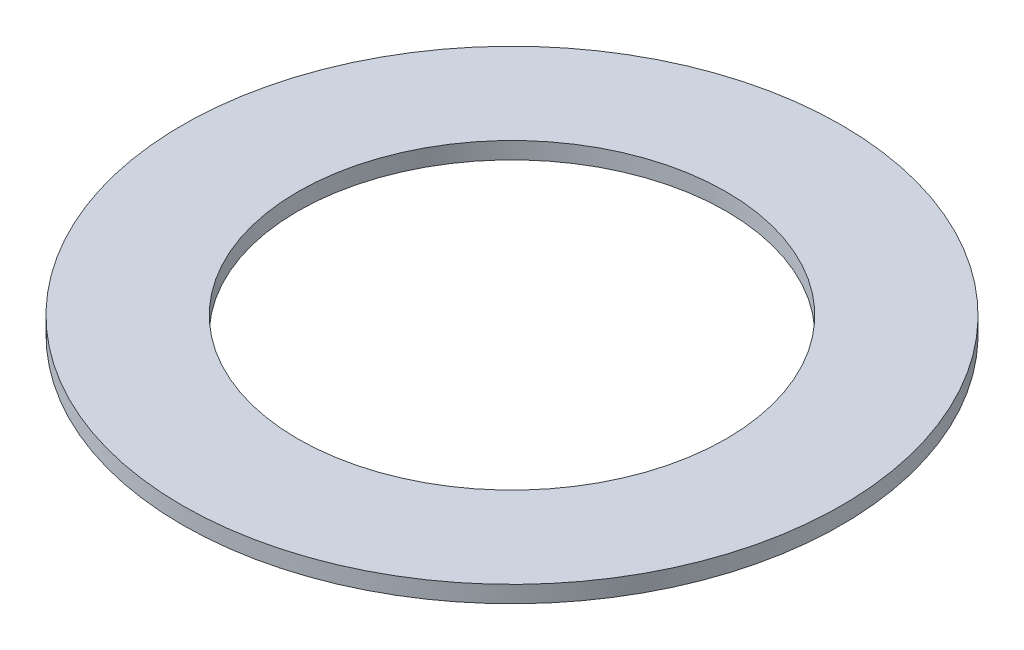
ISO-10303-21;
HEADER;
FILE_DESCRIPTION(('STEP AP214'),'2;1');
FILE_NAME('part.step','',(''),(''),'','','');
FILE_SCHEMA(('AUTOMOTIVE_DESIGN { 1 0 10303 214 1 1 1 1 }'));
ENDSEC;
DATA;
#1=APPLICATION_CONTEXT('core data for automotive mechanical design processes');
#2=APPLICATION_PROTOCOL_DEFINITION('international standard','automotive_design',2000,#1);
#3=PRODUCT_CONTEXT('',#1,'mechanical');
#4=PRODUCT('Part','Part','',(#3));
#5=PRODUCT_RELATED_PRODUCT_CATEGORY('part','',(#4));
#6=PRODUCT_DEFINITION_FORMATION('','',#4);
#7=PRODUCT_DEFINITION_CONTEXT('part definition',#1,'design');
#8=PRODUCT_DEFINITION('design','',#6,#7);
#9=PRODUCT_DEFINITION_SHAPE('','',#8);
#10=(LENGTH_UNIT() NAMED_UNIT(*) SI_UNIT(.MILLI.,.METRE.));
#11=(NAMED_UNIT(*) PLANE_ANGLE_UNIT() SI_UNIT($,.RADIAN.));
#12=(NAMED_UNIT(*) SI_UNIT($,.STERADIAN.) SOLID_ANGLE_UNIT());
#13=UNCERTAINTY_MEASURE_WITH_UNIT(LENGTH_MEASURE(1.E-05),#10,'distance_accuracy_value','');
#14=(GEOMETRIC_REPRESENTATION_CONTEXT(3) GLOBAL_UNCERTAINTY_ASSIGNED_CONTEXT((#13)) GLOBAL_UNIT_ASSIGNED_CONTEXT((#10,
#11,#12)) REPRESENTATION_CONTEXT('',''));
#15=CARTESIAN_POINT('',(0.,0.,0.));
#16=DIRECTION('',(0.,0.,1.));
#17=DIRECTION('',(1.,0.,0.));
#18=AXIS2_PLACEMENT_3D('',#15,#16,#17);
#19=CARTESIAN_POINT('',(0.,4.,0.));
#20=DIRECTION('',(0.,1.,0.));
#21=DIRECTION('',(0.,0.,1.));
#22=AXIS2_PLACEMENT_3D('',#19,#20,#21);
#23=PLANE('',#22);
#24=CARTESIAN_POINT('',(0.,4.,0.));
#25=DIRECTION('',(0.,1.,0.));
#26=DIRECTION('',(0.,0.,1.));
#27=AXIS2_PLACEMENT_3D('',#24,#25,#26);
#28=CIRCLE('',#27,78.5);
#29=CARTESIAN_POINT('',(0.,4.,78.5));
#30=VERTEX_POINT('',#29);
#31=EDGE_CURVE('E10',#30,#30,#28,.T.);
#32=ORIENTED_EDGE('',*,*,#31,.T.);
#33=EDGE_LOOP('',(#32));
#34=FACE_BOUND('',#33,.T.);
#35=CARTESIAN_POINT('',(0.,4.,0.));
#36=DIRECTION('',(0.,1.,0.));
#37=DIRECTION('',(0.,0.,1.));
#38=AXIS2_PLACEMENT_3D('',#35,#36,#37);
#39=CIRCLE('',#38,51.);
#40=CARTESIAN_POINT('',(0.,4.,51.));
#41=VERTEX_POINT('',#40);
#42=EDGE_CURVE('E50',#41,#41,#39,.T.);
#43=ORIENTED_EDGE('',*,*,#42,.F.);
#44=EDGE_LOOP('',(#43));
#45=FACE_BOUND('',#44,.T.);
#46=ADVANCED_FACE('F37',(#34,#45),#23,.T.);
#47=CARTESIAN_POINT('',(0.,0.,0.));
#48=DIRECTION('',(0.,1.,0.));
#49=DIRECTION('',(0.,0.,1.));
#50=AXIS2_PLACEMENT_3D('',#47,#48,#49);
#51=PLANE('',#50);
#52=CARTESIAN_POINT('',(0.,0.,0.));
#53=DIRECTION('',(0.,1.,0.));
#54=DIRECTION('',(0.,0.,1.));
#55=AXIS2_PLACEMENT_3D('',#52,#53,#54);
#56=CIRCLE('',#55,78.5);
#57=CARTESIAN_POINT('',(0.,0.,78.5));
#58=VERTEX_POINT('',#57);
#59=EDGE_CURVE('E41',#58,#58,#56,.T.);
#60=ORIENTED_EDGE('',*,*,#59,.F.);
#61=EDGE_LOOP('',(#60));
#62=FACE_BOUND('',#61,.T.);
#63=CARTESIAN_POINT('',(0.,0.,0.));
#64=DIRECTION('',(0.,1.,0.));
#65=DIRECTION('',(0.,0.,1.));
#66=AXIS2_PLACEMENT_3D('',#63,#64,#65);
#67=CIRCLE('',#66,51.);
#68=CARTESIAN_POINT('',(0.,0.,51.));
#69=VERTEX_POINT('',#68);
#70=EDGE_CURVE('E52',#69,#69,#67,.T.);
#71=ORIENTED_EDGE('',*,*,#70,.T.);
#72=EDGE_LOOP('',(#71));
#73=FACE_BOUND('',#72,.T.);
#74=ADVANCED_FACE('F64',(#62,#73),#51,.F.);
#75=CARTESIAN_POINT('',(0.,4.,0.));
#76=DIRECTION('',(0.,-1.,0.));
#77=DIRECTION('',(0.,0.,-1.));
#78=AXIS2_PLACEMENT_3D('',#75,#76,#77);
#79=CYLINDRICAL_SURFACE('',#78,78.5);
#80=ORIENTED_EDGE('',*,*,#31,.F.);
#81=EDGE_LOOP('',(#80));
#82=FACE_BOUND('',#81,.T.);
#83=ORIENTED_EDGE('',*,*,#59,.T.);
#84=EDGE_LOOP('',(#83));
#85=FACE_BOUND('',#84,.T.);
#86=ADVANCED_FACE('F39',(#82,#85),#79,.T.);
#87=CARTESIAN_POINT('',(0.,4.,0.));
#88=DIRECTION('',(0.,-1.,0.));
#89=DIRECTION('',(0.,0.,-1.));
#90=AXIS2_PLACEMENT_3D('',#87,#88,#89);
#91=CYLINDRICAL_SURFACE('',#90,51.);
#92=ORIENTED_EDGE('',*,*,#42,.T.);
#93=EDGE_LOOP('',(#92));
#94=FACE_BOUND('',#93,.T.);
#95=ORIENTED_EDGE('',*,*,#70,.F.);
#96=EDGE_LOOP('',(#95));
#97=FACE_BOUND('',#96,.T.);
#98=ADVANCED_FACE('F60',(#94,#97),#91,.F.);
#99=CLOSED_SHELL('',(#46,#74,#86,#98));
#100=MANIFOLD_SOLID_BREP('B2',#99);
#101=ADVANCED_BREP_SHAPE_REPRESENTATION('',(#18,#100),#14);
#102=SHAPE_DEFINITION_REPRESENTATION(#9,#101);
ENDSEC;
END-ISO-10303-21;
